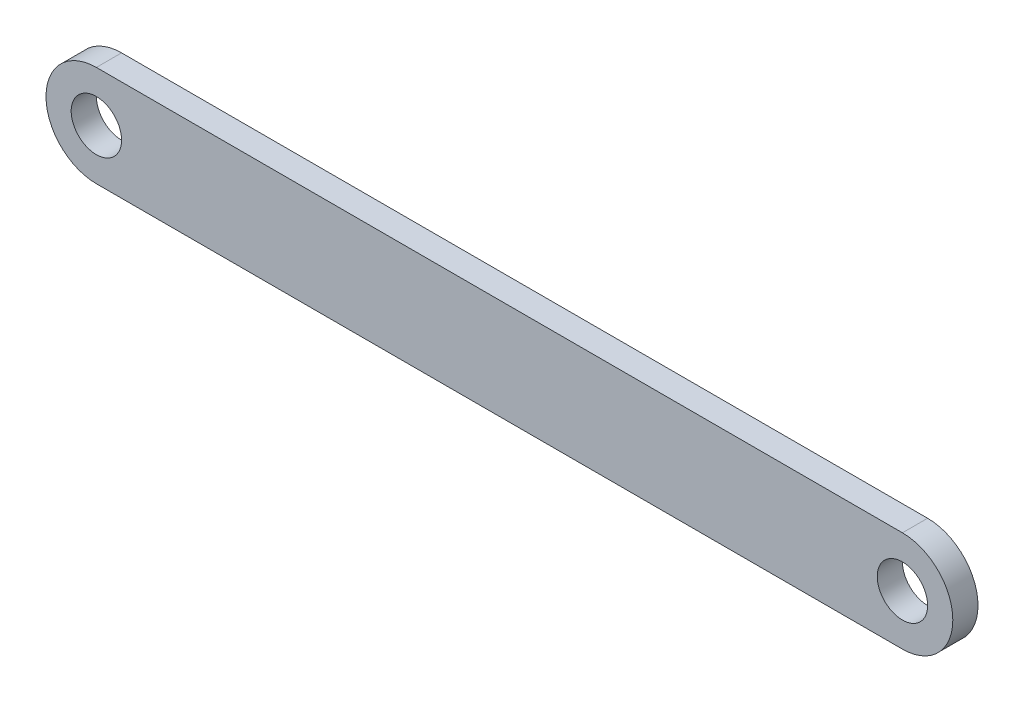
ISO-10303-21;
HEADER;
FILE_DESCRIPTION(('STEP AP214'),'2;1');
FILE_NAME('part.step','',(''),(''),'','','');
FILE_SCHEMA(('AUTOMOTIVE_DESIGN { 1 0 10303 214 1 1 1 1 }'));
ENDSEC;
DATA;
#1=APPLICATION_CONTEXT('core data for automotive mechanical design processes');
#2=APPLICATION_PROTOCOL_DEFINITION('international standard','automotive_design',2000,#1);
#3=PRODUCT_CONTEXT('',#1,'mechanical');
#4=PRODUCT('Part','Part','',(#3));
#5=PRODUCT_RELATED_PRODUCT_CATEGORY('part','',(#4));
#6=PRODUCT_DEFINITION_FORMATION('','',#4);
#7=PRODUCT_DEFINITION_CONTEXT('part definition',#1,'design');
#8=PRODUCT_DEFINITION('design','',#6,#7);
#9=PRODUCT_DEFINITION_SHAPE('','',#8);
#10=(LENGTH_UNIT() NAMED_UNIT(*) SI_UNIT(.MILLI.,.METRE.));
#11=(NAMED_UNIT(*) PLANE_ANGLE_UNIT() SI_UNIT($,.RADIAN.));
#12=(NAMED_UNIT(*) SI_UNIT($,.STERADIAN.) SOLID_ANGLE_UNIT());
#13=UNCERTAINTY_MEASURE_WITH_UNIT(LENGTH_MEASURE(1.E-05),#10,'distance_accuracy_value','');
#14=(GEOMETRIC_REPRESENTATION_CONTEXT(3) GLOBAL_UNCERTAINTY_ASSIGNED_CONTEXT((#13)) GLOBAL_UNIT_ASSIGNED_CONTEXT((#10,
#11,#12)) REPRESENTATION_CONTEXT('',''));
#15=CARTESIAN_POINT('',(0.,0.,0.));
#16=DIRECTION('',(0.,0.,1.));
#17=DIRECTION('',(1.,0.,0.));
#18=AXIS2_PLACEMENT_3D('',#15,#16,#17);
#19=CARTESIAN_POINT('',(80.,0.,5.));
#20=DIRECTION('',(0.,0.,1.));
#21=DIRECTION('',(1.,0.,0.));
#22=AXIS2_PLACEMENT_3D('',#19,#20,#21);
#23=PLANE('',#22);
#24=CARTESIAN_POINT('',(80.,0.,5.));
#25=DIRECTION('',(0.,0.,1.));
#26=DIRECTION('',(1.,0.,0.));
#27=AXIS2_PLACEMENT_3D('',#24,#25,#26);
#28=CIRCLE('',#27,5.);
#29=CARTESIAN_POINT('',(85.,0.,5.));
#30=VERTEX_POINT('',#29);
#31=EDGE_CURVE('E100',#30,#30,#28,.T.);
#32=ORIENTED_EDGE('',*,*,#31,.F.);
#33=EDGE_LOOP('',(#32));
#34=FACE_BOUND('',#33,.T.);
#35=CARTESIAN_POINT('',(80.,0.,5.));
#36=DIRECTION('',(0.,0.,1.));
#37=DIRECTION('',(1.,0.,0.));
#38=AXIS2_PLACEMENT_3D('',#35,#36,#37);
#39=CIRCLE('',#38,10.);
#40=CARTESIAN_POINT('',(80.,-9.99999999999996,5.));
#41=VERTEX_POINT('',#40);
#42=CARTESIAN_POINT('',(80.,10.,5.));
#43=VERTEX_POINT('',#42);
#44=EDGE_CURVE('E85',#41,#43,#39,.T.);
#45=ORIENTED_EDGE('',*,*,#44,.T.);
#46=DIRECTION('',(-1.,0.,0.));
#47=VECTOR('',#46,1.);
#48=CARTESIAN_POINT('',(80.,10.,5.));
#49=LINE('',#48,#47);
#50=CARTESIAN_POINT('',(-80.,10.,5.));
#51=VERTEX_POINT('',#50);
#52=EDGE_CURVE('E80',#43,#51,#49,.T.);
#53=ORIENTED_EDGE('',*,*,#52,.T.);
#54=CARTESIAN_POINT('',(-80.,0.,5.));
#55=DIRECTION('',(0.,0.,1.));
#56=DIRECTION('',(1.,0.,0.));
#57=AXIS2_PLACEMENT_3D('',#54,#55,#56);
#58=CIRCLE('',#57,10.);
#59=CARTESIAN_POINT('',(-80.,-9.99999999999997,5.));
#60=VERTEX_POINT('',#59);
#61=EDGE_CURVE('E83',#51,#60,#58,.T.);
#62=ORIENTED_EDGE('',*,*,#61,.T.);
#63=DIRECTION('',(1.,0.,0.));
#64=VECTOR('',#63,1.);
#65=CARTESIAN_POINT('',(80.,-9.99999999999996,5.));
#66=LINE('',#65,#64);
#67=EDGE_CURVE('E50',#60,#41,#66,.T.);
#68=ORIENTED_EDGE('',*,*,#67,.T.);
#69=EDGE_LOOP('',(#45,#53,#62,#68));
#70=FACE_BOUND('',#69,.T.);
#71=CARTESIAN_POINT('',(-80.,0.,5.));
#72=DIRECTION('',(0.,0.,1.));
#73=DIRECTION('',(1.,0.,0.));
#74=AXIS2_PLACEMENT_3D('',#71,#72,#73);
#75=CIRCLE('',#74,5.);
#76=CARTESIAN_POINT('',(-75.,0.,5.));
#77=VERTEX_POINT('',#76);
#78=EDGE_CURVE('E115',#77,#77,#75,.T.);
#79=ORIENTED_EDGE('',*,*,#78,.F.);
#80=EDGE_LOOP('',(#79));
#81=FACE_BOUND('',#80,.T.);
#82=ADVANCED_FACE('F33',(#34,#70,#81),#23,.T.);
#83=CARTESIAN_POINT('',(80.,0.,0.));
#84=DIRECTION('',(0.,0.,1.));
#85=DIRECTION('',(1.,0.,0.));
#86=AXIS2_PLACEMENT_3D('',#83,#84,#85);
#87=PLANE('',#86);
#88=CARTESIAN_POINT('',(80.,0.,0.));
#89=DIRECTION('',(0.,0.,1.));
#90=DIRECTION('',(1.,0.,0.));
#91=AXIS2_PLACEMENT_3D('',#88,#89,#90);
#92=CIRCLE('',#91,10.);
#93=CARTESIAN_POINT('',(80.,-9.99999999999996,0.));
#94=VERTEX_POINT('',#93);
#95=CARTESIAN_POINT('',(80.,10.,0.));
#96=VERTEX_POINT('',#95);
#97=EDGE_CURVE('E97',#94,#96,#92,.T.);
#98=ORIENTED_EDGE('',*,*,#97,.F.);
#99=DIRECTION('',(1.,0.,0.));
#100=VECTOR('',#99,1.);
#101=CARTESIAN_POINT('',(80.,-9.99999999999996,0.));
#102=LINE('',#101,#100);
#103=CARTESIAN_POINT('',(-80.,-9.99999999999997,0.));
#104=VERTEX_POINT('',#103);
#105=EDGE_CURVE('E73',#104,#94,#102,.T.);
#106=ORIENTED_EDGE('',*,*,#105,.F.);
#107=CARTESIAN_POINT('',(-80.,0.,0.));
#108=DIRECTION('',(0.,0.,1.));
#109=DIRECTION('',(1.,0.,0.));
#110=AXIS2_PLACEMENT_3D('',#107,#108,#109);
#111=CIRCLE('',#110,10.);
#112=CARTESIAN_POINT('',(-80.,10.,0.));
#113=VERTEX_POINT('',#112);
#114=EDGE_CURVE('E67',#113,#104,#111,.T.);
#115=ORIENTED_EDGE('',*,*,#114,.F.);
#116=DIRECTION('',(-1.,0.,0.));
#117=VECTOR('',#116,1.);
#118=CARTESIAN_POINT('',(80.,10.,0.));
#119=LINE('',#118,#117);
#120=EDGE_CURVE('E89',#96,#113,#119,.T.);
#121=ORIENTED_EDGE('',*,*,#120,.F.);
#122=EDGE_LOOP('',(#98,#106,#115,#121));
#123=FACE_BOUND('',#122,.T.);
#124=CARTESIAN_POINT('',(80.,0.,0.));
#125=DIRECTION('',(0.,0.,1.));
#126=DIRECTION('',(1.,0.,0.));
#127=AXIS2_PLACEMENT_3D('',#124,#125,#126);
#128=CIRCLE('',#127,5.);
#129=CARTESIAN_POINT('',(85.,0.,0.));
#130=VERTEX_POINT('',#129);
#131=EDGE_CURVE('E112',#130,#130,#128,.T.);
#132=ORIENTED_EDGE('',*,*,#131,.T.);
#133=EDGE_LOOP('',(#132));
#134=FACE_BOUND('',#133,.T.);
#135=CARTESIAN_POINT('',(-80.,0.,0.));
#136=DIRECTION('',(0.,0.,1.));
#137=DIRECTION('',(1.,0.,0.));
#138=AXIS2_PLACEMENT_3D('',#135,#136,#137);
#139=CIRCLE('',#138,5.);
#140=CARTESIAN_POINT('',(-75.,0.,0.));
#141=VERTEX_POINT('',#140);
#142=EDGE_CURVE('E118',#141,#141,#139,.T.);
#143=ORIENTED_EDGE('',*,*,#142,.T.);
#144=EDGE_LOOP('',(#143));
#145=FACE_BOUND('',#144,.T.);
#146=ADVANCED_FACE('F108',(#123,#134,#145),#87,.F.);
#147=CARTESIAN_POINT('',(80.,0.,5.));
#148=DIRECTION('',(0.,0.,-1.));
#149=DIRECTION('',(-1.,0.,0.));
#150=AXIS2_PLACEMENT_3D('',#147,#148,#149);
#151=CYLINDRICAL_SURFACE('',#150,10.);
#152=ORIENTED_EDGE('',*,*,#97,.T.);
#153=DIRECTION('',(0.,0.,-1.));
#154=VECTOR('',#153,1.);
#155=CARTESIAN_POINT('',(80.,10.,5.));
#156=LINE('',#155,#154);
#157=EDGE_CURVE('E11',#43,#96,#156,.T.);
#158=ORIENTED_EDGE('',*,*,#157,.F.);
#159=ORIENTED_EDGE('',*,*,#44,.F.);
#160=DIRECTION('',(0.,0.,-1.));
#161=VECTOR('',#160,1.);
#162=CARTESIAN_POINT('',(80.,-9.99999999999996,5.));
#163=LINE('',#162,#161);
#164=EDGE_CURVE('E93',#41,#94,#163,.T.);
#165=ORIENTED_EDGE('',*,*,#164,.T.);
#166=EDGE_LOOP('',(#152,#158,#159,#165));
#167=FACE_BOUND('',#166,.T.);
#168=ADVANCED_FACE('F35',(#167),#151,.T.);
#169=CARTESIAN_POINT('',(80.,10.,5.));
#170=DIRECTION('',(0.,-1.,0.));
#171=DIRECTION('',(1.,0.,0.));
#172=AXIS2_PLACEMENT_3D('',#169,#170,#171);
#173=PLANE('',#172);
#174=ORIENTED_EDGE('',*,*,#120,.T.);
#175=DIRECTION('',(0.,0.,-1.));
#176=VECTOR('',#175,1.);
#177=CARTESIAN_POINT('',(-80.,10.,5.));
#178=LINE('',#177,#176);
#179=EDGE_CURVE('E42',#51,#113,#178,.T.);
#180=ORIENTED_EDGE('',*,*,#179,.F.);
#181=ORIENTED_EDGE('',*,*,#52,.F.);
#182=ORIENTED_EDGE('',*,*,#157,.T.);
#183=EDGE_LOOP('',(#174,#180,#181,#182));
#184=FACE_BOUND('',#183,.T.);
#185=ADVANCED_FACE('F88',(#184),#173,.F.);
#186=CARTESIAN_POINT('',(-80.,0.,5.));
#187=DIRECTION('',(0.,0.,-1.));
#188=DIRECTION('',(-1.,0.,0.));
#189=AXIS2_PLACEMENT_3D('',#186,#187,#188);
#190=CYLINDRICAL_SURFACE('',#189,10.);
#191=ORIENTED_EDGE('',*,*,#114,.T.);
#192=DIRECTION('',(0.,0.,-1.));
#193=VECTOR('',#192,1.);
#194=CARTESIAN_POINT('',(-80.,-9.99999999999997,5.));
#195=LINE('',#194,#193);
#196=EDGE_CURVE('E90',#60,#104,#195,.T.);
#197=ORIENTED_EDGE('',*,*,#196,.F.);
#198=ORIENTED_EDGE('',*,*,#61,.F.);
#199=ORIENTED_EDGE('',*,*,#179,.T.);
#200=EDGE_LOOP('',(#191,#197,#198,#199));
#201=FACE_BOUND('',#200,.T.);
#202=ADVANCED_FACE('F91',(#201),#190,.T.);
#203=CARTESIAN_POINT('',(80.,-9.99999999999996,5.));
#204=DIRECTION('',(0.,1.,0.));
#205=DIRECTION('',(-1.,0.,0.));
#206=AXIS2_PLACEMENT_3D('',#203,#204,#205);
#207=PLANE('',#206);
#208=ORIENTED_EDGE('',*,*,#105,.T.);
#209=ORIENTED_EDGE('',*,*,#164,.F.);
#210=ORIENTED_EDGE('',*,*,#67,.F.);
#211=ORIENTED_EDGE('',*,*,#196,.T.);
#212=EDGE_LOOP('',(#208,#209,#210,#211));
#213=FACE_BOUND('',#212,.T.);
#214=ADVANCED_FACE('F105',(#213),#207,.F.);
#215=CARTESIAN_POINT('',(80.,0.,5.));
#216=DIRECTION('',(0.,0.,-1.));
#217=DIRECTION('',(-1.,0.,0.));
#218=AXIS2_PLACEMENT_3D('',#215,#216,#217);
#219=CYLINDRICAL_SURFACE('',#218,5.);
#220=ORIENTED_EDGE('',*,*,#31,.T.);
#221=EDGE_LOOP('',(#220));
#222=FACE_BOUND('',#221,.T.);
#223=ORIENTED_EDGE('',*,*,#131,.F.);
#224=EDGE_LOOP('',(#223));
#225=FACE_BOUND('',#224,.T.);
#226=ADVANCED_FACE('F135',(#222,#225),#219,.F.);
#227=CARTESIAN_POINT('',(-80.,0.,5.));
#228=DIRECTION('',(0.,0.,-1.));
#229=DIRECTION('',(-1.,0.,0.));
#230=AXIS2_PLACEMENT_3D('',#227,#228,#229);
#231=CYLINDRICAL_SURFACE('',#230,5.);
#232=ORIENTED_EDGE('',*,*,#78,.T.);
#233=EDGE_LOOP('',(#232));
#234=FACE_BOUND('',#233,.T.);
#235=ORIENTED_EDGE('',*,*,#142,.F.);
#236=EDGE_LOOP('',(#235));
#237=FACE_BOUND('',#236,.T.);
#238=ADVANCED_FACE('F124',(#234,#237),#231,.F.);
#239=CLOSED_SHELL('',(#82,#146,#168,#185,#202,#214,#226,#238));
#240=MANIFOLD_SOLID_BREP('B2',#239);
#241=ADVANCED_BREP_SHAPE_REPRESENTATION('',(#18,#240),#14);
#242=SHAPE_DEFINITION_REPRESENTATION(#9,#241);
ENDSEC;
END-ISO-10303-21;
